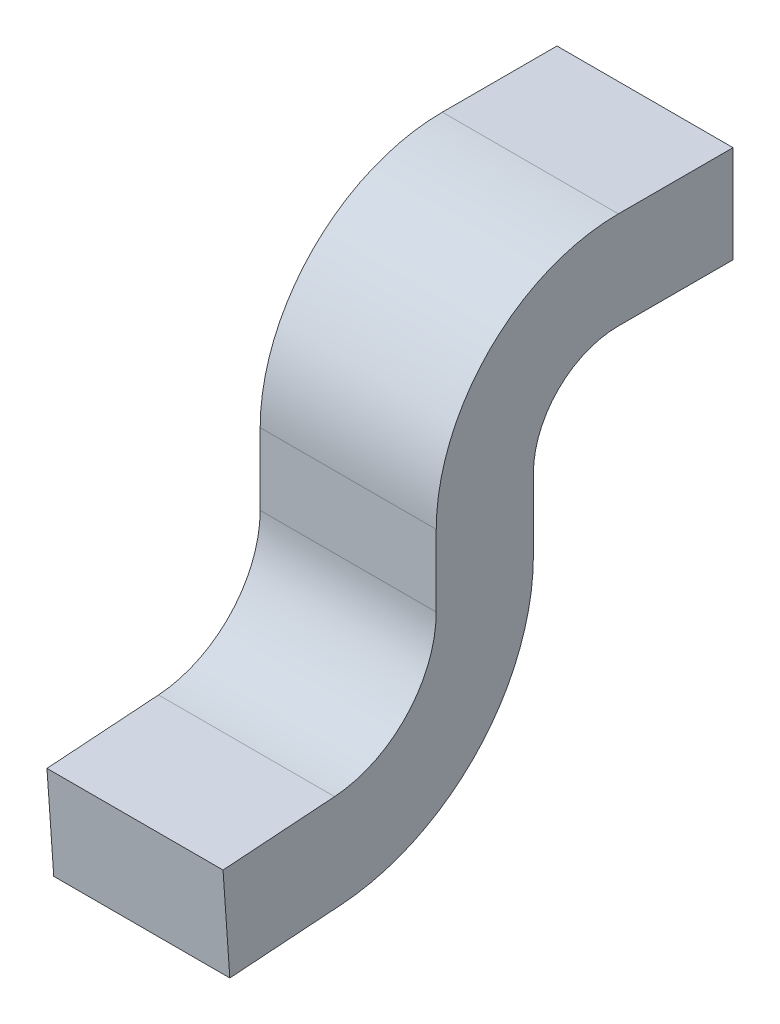
ISO-10303-21;
HEADER;
FILE_DESCRIPTION(('STEP AP214'),'2;1');
FILE_NAME('part.step','',(''),(''),'','','');
FILE_SCHEMA(('AUTOMOTIVE_DESIGN { 1 0 10303 214 1 1 1 1 }'));
ENDSEC;
DATA;
#1=APPLICATION_CONTEXT('core data for automotive mechanical design processes');
#2=APPLICATION_PROTOCOL_DEFINITION('international standard','automotive_design',2000,#1);
#3=PRODUCT_CONTEXT('',#1,'mechanical');
#4=PRODUCT('Part','Part','',(#3));
#5=PRODUCT_RELATED_PRODUCT_CATEGORY('part','',(#4));
#6=PRODUCT_DEFINITION_FORMATION('','',#4);
#7=PRODUCT_DEFINITION_CONTEXT('part definition',#1,'design');
#8=PRODUCT_DEFINITION('design','',#6,#7);
#9=PRODUCT_DEFINITION_SHAPE('','',#8);
#10=(LENGTH_UNIT() NAMED_UNIT(*) SI_UNIT(.MILLI.,.METRE.));
#11=(NAMED_UNIT(*) PLANE_ANGLE_UNIT() SI_UNIT($,.RADIAN.));
#12=(NAMED_UNIT(*) SI_UNIT($,.STERADIAN.) SOLID_ANGLE_UNIT());
#13=UNCERTAINTY_MEASURE_WITH_UNIT(LENGTH_MEASURE(1.E-05),#10,'distance_accuracy_value','');
#14=(GEOMETRIC_REPRESENTATION_CONTEXT(3) GLOBAL_UNCERTAINTY_ASSIGNED_CONTEXT((#13)) GLOBAL_UNIT_ASSIGNED_CONTEXT((#10,
#11,#12)) REPRESENTATION_CONTEXT('',''));
#15=CARTESIAN_POINT('',(0.,0.,0.));
#16=DIRECTION('',(0.,0.,1.));
#17=DIRECTION('',(1.,0.,0.));
#18=AXIS2_PLACEMENT_3D('',#15,#16,#17);
#19=CARTESIAN_POINT('',(-0.18415,0.,0.));
#20=DIRECTION('',(1.,0.,0.));
#21=DIRECTION('',(0.,0.,-1.));
#22=AXIS2_PLACEMENT_3D('',#19,#20,#21);
#23=PLANE('',#22);
#24=DIRECTION('',(0.,-0.997564050259825,-0.0697564737441177));
#25=VECTOR('',#24,1.);
#26=CARTESIAN_POINT('',(-0.18415,-0.152894984987,0.649174515465));
#27=LINE('',#26,#25);
#28=CARTESIAN_POINT('',(-0.18415,-0.152894984987171,0.649174515464988));
#29=VERTEX_POINT('',#28);
#30=CARTESIAN_POINT('',(-0.18415,-0.355600000000004,0.63500000000006));
#31=VERTEX_POINT('',#30);
#32=EDGE_CURVE('E186',#29,#31,#27,.T.);
#33=ORIENTED_EDGE('',*,*,#32,.F.);
#34=DIRECTION('',(0.,-0.0697564737441177,0.997564050259825));
#35=VECTOR('',#34,1.);
#36=CARTESIAN_POINT('',(-0.18415,-0.121709408913,0.2032));
#37=LINE('',#36,#35);
#38=CARTESIAN_POINT('',(-0.18415,-0.13657960211132,0.415853670102026));
#39=VERTEX_POINT('',#38);
#40=EDGE_CURVE('E192',#39,#29,#37,.T.);
#41=ORIENTED_EDGE('',*,*,#40,.F.);
#42=CARTESIAN_POINT('',(-0.18415,0.09146353977837,0.4318));
#43=DIRECTION('',(1.,0.,0.));
#44=DIRECTION('',(0.,0.,-1.));
#45=AXIS2_PLACEMENT_3D('',#42,#43,#44);
#46=CIRCLE('',#45,0.2286);
#47=CARTESIAN_POINT('',(-0.18415,0.09146353977837,0.2032));
#48=VERTEX_POINT('',#47);
#49=EDGE_CURVE('E200',#39,#48,#46,.T.);
#50=ORIENTED_EDGE('',*,*,#49,.T.);
#51=DIRECTION('',(0.,1.,0.));
#52=VECTOR('',#51,1.);
#53=CARTESIAN_POINT('',(-0.18415,0.,0.2032));
#54=LINE('',#53,#52);
#55=CARTESIAN_POINT('',(-0.18415,0.2413,0.2032));
#56=VERTEX_POINT('',#55);
#57=EDGE_CURVE('E136',#56,#48,#54,.F.);
#58=ORIENTED_EDGE('',*,*,#57,.F.);
#59=CARTESIAN_POINT('',(-0.18415,0.2413,-0.1778));
#60=DIRECTION('',(-1.,0.,0.));
#61=DIRECTION('',(0.,0.,1.));
#62=AXIS2_PLACEMENT_3D('',#59,#60,#61);
#63=CIRCLE('',#62,0.381);
#64=CARTESIAN_POINT('',(-0.18415,0.6223,-0.1778));
#65=VERTEX_POINT('',#64);
#66=EDGE_CURVE('E20',#65,#56,#63,.F.);
#67=ORIENTED_EDGE('',*,*,#66,.F.);
#68=DIRECTION('',(0.,0.,1.));
#69=VECTOR('',#68,1.);
#70=CARTESIAN_POINT('',(-0.18415,0.6223,-0.417625484535));
#71=LINE('',#70,#69);
#72=CARTESIAN_POINT('',(-0.18415,0.6223,-0.417625484535));
#73=VERTEX_POINT('',#72);
#74=EDGE_CURVE('E134',#73,#65,#71,.T.);
#75=ORIENTED_EDGE('',*,*,#74,.F.);
#76=DIRECTION('',(0.,1.,0.));
#77=VECTOR('',#76,1.);
#78=CARTESIAN_POINT('',(-0.18415,0.4191,-0.417625484535));
#79=LINE('',#78,#77);
#80=CARTESIAN_POINT('',(-0.18415,0.4191,-0.417625484535));
#81=VERTEX_POINT('',#80);
#82=EDGE_CURVE('E154',#81,#73,#79,.T.);
#83=ORIENTED_EDGE('',*,*,#82,.F.);
#84=DIRECTION('',(0.,0.,-1.));
#85=VECTOR('',#84,1.);
#86=CARTESIAN_POINT('',(-0.18415,0.4191,0.));
#87=LINE('',#86,#85);
#88=CARTESIAN_POINT('',(-0.18415,0.4191,-0.1778));
#89=VERTEX_POINT('',#88);
#90=EDGE_CURVE('E166',#89,#81,#87,.T.);
#91=ORIENTED_EDGE('',*,*,#90,.F.);
#92=CARTESIAN_POINT('',(-0.18415,0.2413,-0.1778));
#93=DIRECTION('',(1.,0.,0.));
#94=DIRECTION('',(0.,0.,-1.));
#95=AXIS2_PLACEMENT_3D('',#92,#93,#94);
#96=CIRCLE('',#95,0.1778);
#97=CARTESIAN_POINT('',(-0.18415,0.2413,0.));
#98=VERTEX_POINT('',#97);
#99=EDGE_CURVE('E176',#89,#98,#96,.T.);
#100=ORIENTED_EDGE('',*,*,#99,.T.);
#101=DIRECTION('',(0.,1.,0.));
#102=VECTOR('',#101,1.);
#103=CARTESIAN_POINT('',(-0.18415,-0.311196474416,0.));
#104=LINE('',#103,#102);
#105=CARTESIAN_POINT('',(-0.18415,0.09146353977837,0.));
#106=VERTEX_POINT('',#105);
#107=EDGE_CURVE('E172',#106,#98,#104,.T.);
#108=ORIENTED_EDGE('',*,*,#107,.F.);
#109=CARTESIAN_POINT('',(-0.18415,0.09146353977837,0.4318));
#110=DIRECTION('',(-1.,0.,0.));
#111=DIRECTION('',(0.,0.,1.));
#112=AXIS2_PLACEMENT_3D('',#109,#110,#111);
#113=CIRCLE('',#112,0.4318);
#114=CARTESIAN_POINT('',(-0.18415,-0.339284617123813,0.401679154637152));
#115=VERTEX_POINT('',#114);
#116=EDGE_CURVE('E182',#115,#106,#113,.F.);
#117=ORIENTED_EDGE('',*,*,#116,.F.);
#118=DIRECTION('',(0.,0.0697564737441177,-0.997564050259825));
#119=VECTOR('',#118,1.);
#120=CARTESIAN_POINT('',(-0.18415,-0.3556,0.635));
#121=LINE('',#120,#119);
#122=EDGE_CURVE('E178',#31,#115,#121,.T.);
#123=ORIENTED_EDGE('',*,*,#122,.F.);
#124=EDGE_LOOP('',(#33,#41,#50,#58,#67,#75,#83,#91,#100,#108,#117,#123));
#125=FACE_BOUND('',#124,.T.);
#126=ADVANCED_FACE('F17',(#125),#23,.F.);
#127=CARTESIAN_POINT('',(-0.18415,0.2413,-0.1778));
#128=DIRECTION('',(-1.,0.,0.));
#129=DIRECTION('',(0.,0.,1.));
#130=AXIS2_PLACEMENT_3D('',#127,#128,#129);
#131=CYLINDRICAL_SURFACE('',#130,0.381);
#132=CARTESIAN_POINT('',(0.18415,0.2413,-0.1778));
#133=DIRECTION('',(-1.,0.,0.));
#134=DIRECTION('',(0.,0.,1.));
#135=AXIS2_PLACEMENT_3D('',#132,#133,#134);
#136=CIRCLE('',#135,0.381);
#137=CARTESIAN_POINT('',(0.18415,0.6223,-0.1778));
#138=VERTEX_POINT('',#137);
#139=CARTESIAN_POINT('',(0.18415,0.2413,0.2032));
#140=VERTEX_POINT('',#139);
#141=EDGE_CURVE('E145',#138,#140,#136,.F.);
#142=ORIENTED_EDGE('',*,*,#141,.F.);
#143=DIRECTION('',(1.,0.,0.));
#144=VECTOR('',#143,1.);
#145=CARTESIAN_POINT('',(-0.18415,0.6223,-0.1778));
#146=LINE('',#145,#144);
#147=EDGE_CURVE('E142',#65,#138,#146,.T.);
#148=ORIENTED_EDGE('',*,*,#147,.F.);
#149=ORIENTED_EDGE('',*,*,#66,.T.);
#150=DIRECTION('',(1.,0.,0.));
#151=VECTOR('',#150,1.);
#152=CARTESIAN_POINT('',(-0.18415,0.2413,0.2032));
#153=LINE('',#152,#151);
#154=EDGE_CURVE('E140',#140,#56,#153,.F.);
#155=ORIENTED_EDGE('',*,*,#154,.F.);
#156=EDGE_LOOP('',(#142,#148,#149,#155));
#157=FACE_BOUND('',#156,.T.);
#158=ADVANCED_FACE('F143',(#157),#131,.T.);
#159=CARTESIAN_POINT('',(-0.18415,0.,0.2032));
#160=DIRECTION('',(0.,0.,1.));
#161=DIRECTION('',(1.,0.,0.));
#162=AXIS2_PLACEMENT_3D('',#159,#160,#161);
#163=PLANE('',#162);
#164=DIRECTION('',(1.,0.,0.));
#165=VECTOR('',#164,1.);
#166=CARTESIAN_POINT('',(-0.18415,0.09146353977837,0.2032));
#167=LINE('',#166,#165);
#168=CARTESIAN_POINT('',(0.18415,0.09146353977837,0.2032));
#169=VERTEX_POINT('',#168);
#170=EDGE_CURVE('E226',#48,#169,#167,.T.);
#171=ORIENTED_EDGE('',*,*,#170,.T.);
#172=DIRECTION('',(0.,1.,0.));
#173=VECTOR('',#172,1.);
#174=CARTESIAN_POINT('',(0.18415,0.,0.2032));
#175=LINE('',#174,#173);
#176=EDGE_CURVE('E217',#140,#169,#175,.F.);
#177=ORIENTED_EDGE('',*,*,#176,.F.);
#178=ORIENTED_EDGE('',*,*,#154,.T.);
#179=ORIENTED_EDGE('',*,*,#57,.T.);
#180=EDGE_LOOP('',(#171,#177,#178,#179));
#181=FACE_BOUND('',#180,.T.);
#182=ADVANCED_FACE('F408',(#181),#163,.T.);
#183=CARTESIAN_POINT('',(-0.18415,0.09146353977837,0.4318));
#184=DIRECTION('',(1.,0.,0.));
#185=DIRECTION('',(0.,0.,-1.));
#186=AXIS2_PLACEMENT_3D('',#183,#184,#185);
#187=CYLINDRICAL_SURFACE('',#186,0.2286);
#188=ORIENTED_EDGE('',*,*,#49,.F.);
#189=DIRECTION('',(1.,0.,0.));
#190=VECTOR('',#189,1.);
#191=CARTESIAN_POINT('',(-0.18415,-0.136579602111317,0.415853670101978));
#192=LINE('',#191,#190);
#193=CARTESIAN_POINT('',(0.18415,-0.136579602111168,0.415853670102133));
#194=VERTEX_POINT('',#193);
#195=EDGE_CURVE('E195',#194,#39,#192,.F.);
#196=ORIENTED_EDGE('',*,*,#195,.F.);
#197=CARTESIAN_POINT('',(0.18415,0.09146353977837,0.4318));
#198=DIRECTION('',(1.,0.,0.));
#199=DIRECTION('',(0.,0.,-1.));
#200=AXIS2_PLACEMENT_3D('',#197,#198,#199);
#201=CIRCLE('',#200,0.2286);
#202=EDGE_CURVE('E212',#169,#194,#201,.F.);
#203=ORIENTED_EDGE('',*,*,#202,.F.);
#204=ORIENTED_EDGE('',*,*,#170,.F.);
#205=EDGE_LOOP('',(#188,#196,#203,#204));
#206=FACE_BOUND('',#205,.T.);
#207=ADVANCED_FACE('F398',(#206),#187,.F.);
#208=CARTESIAN_POINT('',(-0.18415,-0.121709408913,0.2032));
#209=DIRECTION('',(0.,0.997564050259825,0.0697564737441177));
#210=DIRECTION('',(0.,-0.0697564737441177,0.997564050259825));
#211=AXIS2_PLACEMENT_3D('',#208,#209,#210);
#212=PLANE('',#211);
#213=DIRECTION('',(1.,0.,0.));
#214=VECTOR('',#213,1.);
#215=CARTESIAN_POINT('',(-0.18415,-0.152894984987,0.649174515465));
#216=LINE('',#215,#214);
#217=CARTESIAN_POINT('',(0.18415,-0.152894984987,0.649174515465));
#218=VERTEX_POINT('',#217);
#219=EDGE_CURVE('E189',#218,#29,#216,.F.);
#220=ORIENTED_EDGE('',*,*,#219,.F.);
#221=DIRECTION('',(0.,-0.0697564737432769,0.997564050259884));
#222=VECTOR('',#221,1.);
#223=CARTESIAN_POINT('',(0.18415,-0.136579602111,0.415853670102));
#224=LINE('',#223,#222);
#225=EDGE_CURVE('E216',#194,#218,#224,.T.);
#226=ORIENTED_EDGE('',*,*,#225,.F.);
#227=ORIENTED_EDGE('',*,*,#195,.T.);
#228=ORIENTED_EDGE('',*,*,#40,.T.);
#229=EDGE_LOOP('',(#220,#226,#227,#228));
#230=FACE_BOUND('',#229,.T.);
#231=ADVANCED_FACE('F388',(#230),#212,.T.);
#232=CARTESIAN_POINT('',(-0.18415,-0.152894984987,0.649174515465));
#233=DIRECTION('',(0.,-0.0697564737441177,0.997564050259825));
#234=DIRECTION('',(0.,-0.997564050259825,-0.0697564737441177));
#235=AXIS2_PLACEMENT_3D('',#232,#233,#234);
#236=PLANE('',#235);
#237=DIRECTION('',(1.,0.,0.));
#238=VECTOR('',#237,1.);
#239=CARTESIAN_POINT('',(-0.18415,-0.3556,0.635));
#240=LINE('',#239,#238);
#241=CARTESIAN_POINT('',(0.18415,-0.3556,0.635));
#242=VERTEX_POINT('',#241);
#243=EDGE_CURVE('E183',#242,#31,#240,.F.);
#244=ORIENTED_EDGE('',*,*,#243,.F.);
#245=DIRECTION('',(0.,-0.997564050259763,-0.0697564737450046));
#246=VECTOR('',#245,1.);
#247=CARTESIAN_POINT('',(0.18415,-0.152894984987,0.649174515465));
#248=LINE('',#247,#246);
#249=EDGE_CURVE('E245',#218,#242,#248,.T.);
#250=ORIENTED_EDGE('',*,*,#249,.F.);
#251=ORIENTED_EDGE('',*,*,#219,.T.);
#252=ORIENTED_EDGE('',*,*,#32,.T.);
#253=EDGE_LOOP('',(#244,#250,#251,#252));
#254=FACE_BOUND('',#253,.T.);
#255=ADVANCED_FACE('F378',(#254),#236,.T.);
#256=CARTESIAN_POINT('',(-0.18415,-0.3556,0.635));
#257=DIRECTION('',(0.,-0.997564050259825,-0.0697564737441177));
#258=DIRECTION('',(0.,0.0697564737441177,-0.997564050259825));
#259=AXIS2_PLACEMENT_3D('',#256,#257,#258);
#260=PLANE('',#259);
#261=DIRECTION('',(-1.,0.,0.));
#262=VECTOR('',#261,1.);
#263=CARTESIAN_POINT('',(-0.18415,-0.339284617123803,0.401679154637014));
#264=LINE('',#263,#262);
#265=CARTESIAN_POINT('',(0.18415,-0.339284617123924,0.401679154637327));
#266=VERTEX_POINT('',#265);
#267=EDGE_CURVE('E224',#266,#115,#264,.T.);
#268=ORIENTED_EDGE('',*,*,#267,.F.);
#269=DIRECTION('',(0.,0.0697564737432772,-0.997564050259884));
#270=VECTOR('',#269,1.);
#271=CARTESIAN_POINT('',(0.18415,-0.3556,0.635));
#272=LINE('',#271,#270);
#273=EDGE_CURVE('E211',#242,#266,#272,.T.);
#274=ORIENTED_EDGE('',*,*,#273,.F.);
#275=ORIENTED_EDGE('',*,*,#243,.T.);
#276=ORIENTED_EDGE('',*,*,#122,.T.);
#277=EDGE_LOOP('',(#268,#274,#275,#276));
#278=FACE_BOUND('',#277,.T.);
#279=ADVANCED_FACE('F368',(#278),#260,.T.);
#280=CARTESIAN_POINT('',(-0.18415,0.09146353977837,0.4318));
#281=DIRECTION('',(-1.,0.,0.));
#282=DIRECTION('',(0.,0.,1.));
#283=AXIS2_PLACEMENT_3D('',#280,#281,#282);
#284=CYLINDRICAL_SURFACE('',#283,0.4318);
#285=CARTESIAN_POINT('',(0.18415,0.09146353977837,0.4318));
#286=DIRECTION('',(-1.,0.,0.));
#287=DIRECTION('',(0.,0.,1.));
#288=AXIS2_PLACEMENT_3D('',#285,#286,#287);
#289=CIRCLE('',#288,0.4318);
#290=CARTESIAN_POINT('',(0.18415,0.09146353977837,0.));
#291=VERTEX_POINT('',#290);
#292=EDGE_CURVE('E207',#266,#291,#289,.F.);
#293=ORIENTED_EDGE('',*,*,#292,.F.);
#294=ORIENTED_EDGE('',*,*,#267,.T.);
#295=ORIENTED_EDGE('',*,*,#116,.T.);
#296=DIRECTION('',(-1.,0.,0.));
#297=VECTOR('',#296,1.);
#298=CARTESIAN_POINT('',(-0.18415,0.09146353977837,0.));
#299=LINE('',#298,#297);
#300=EDGE_CURVE('E177',#291,#106,#299,.T.);
#301=ORIENTED_EDGE('',*,*,#300,.F.);
#302=EDGE_LOOP('',(#293,#294,#295,#301));
#303=FACE_BOUND('',#302,.T.);
#304=ADVANCED_FACE('F358',(#303),#284,.T.);
#305=CARTESIAN_POINT('',(-0.18415,-0.311196474416,0.));
#306=DIRECTION('',(0.,0.,-1.));
#307=DIRECTION('',(-1.,0.,0.));
#308=AXIS2_PLACEMENT_3D('',#305,#306,#307);
#309=PLANE('',#308);
#310=ORIENTED_EDGE('',*,*,#300,.T.);
#311=ORIENTED_EDGE('',*,*,#107,.T.);
#312=DIRECTION('',(1.,0.,0.));
#313=VECTOR('',#312,1.);
#314=CARTESIAN_POINT('',(-0.18415,0.2413,0.));
#315=LINE('',#314,#313);
#316=CARTESIAN_POINT('',(0.18415,0.2413,0.));
#317=VERTEX_POINT('',#316);
#318=EDGE_CURVE('E222',#98,#317,#315,.T.);
#319=ORIENTED_EDGE('',*,*,#318,.T.);
#320=DIRECTION('',(0.,1.,0.));
#321=VECTOR('',#320,1.);
#322=CARTESIAN_POINT('',(0.18415,0.,0.));
#323=LINE('',#322,#321);
#324=EDGE_CURVE('E206',#291,#317,#323,.T.);
#325=ORIENTED_EDGE('',*,*,#324,.F.);
#326=EDGE_LOOP('',(#310,#311,#319,#325));
#327=FACE_BOUND('',#326,.T.);
#328=ADVANCED_FACE('F348',(#327),#309,.T.);
#329=CARTESIAN_POINT('',(-0.18415,0.2413,-0.1778));
#330=DIRECTION('',(1.,0.,0.));
#331=DIRECTION('',(0.,0.,-1.));
#332=AXIS2_PLACEMENT_3D('',#329,#330,#331);
#333=CYLINDRICAL_SURFACE('',#332,0.1778);
#334=ORIENTED_EDGE('',*,*,#99,.F.);
#335=DIRECTION('',(1.,0.,0.));
#336=VECTOR('',#335,1.);
#337=CARTESIAN_POINT('',(-0.18415,0.4191,-0.1778));
#338=LINE('',#337,#336);
#339=CARTESIAN_POINT('',(0.18415,0.4191,-0.1778));
#340=VERTEX_POINT('',#339);
#341=EDGE_CURVE('E169',#340,#89,#338,.F.);
#342=ORIENTED_EDGE('',*,*,#341,.F.);
#343=CARTESIAN_POINT('',(0.18415,0.2413,-0.1778));
#344=DIRECTION('',(1.,0.,0.));
#345=DIRECTION('',(0.,0.,-1.));
#346=AXIS2_PLACEMENT_3D('',#343,#344,#345);
#347=CIRCLE('',#346,0.1778);
#348=EDGE_CURVE('E201',#317,#340,#347,.F.);
#349=ORIENTED_EDGE('',*,*,#348,.F.);
#350=ORIENTED_EDGE('',*,*,#318,.F.);
#351=EDGE_LOOP('',(#334,#342,#349,#350));
#352=FACE_BOUND('',#351,.T.);
#353=ADVANCED_FACE('F314',(#352),#333,.F.);
#354=CARTESIAN_POINT('',(-0.18415,0.4191,0.));
#355=DIRECTION('',(0.,-1.,0.));
#356=DIRECTION('',(0.,0.,-1.));
#357=AXIS2_PLACEMENT_3D('',#354,#355,#356);
#358=PLANE('',#357);
#359=DIRECTION('',(-1.,0.,0.));
#360=VECTOR('',#359,1.);
#361=CARTESIAN_POINT('',(-0.18415,0.4191,-0.417625484535));
#362=LINE('',#361,#360);
#363=CARTESIAN_POINT('',(0.18415,0.4191,-0.417625484535));
#364=VERTEX_POINT('',#363);
#365=EDGE_CURVE('E163',#364,#81,#362,.T.);
#366=ORIENTED_EDGE('',*,*,#365,.F.);
#367=DIRECTION('',(0.,0.,-1.));
#368=VECTOR('',#367,1.);
#369=CARTESIAN_POINT('',(0.18415,0.4191,0.));
#370=LINE('',#369,#368);
#371=EDGE_CURVE('E205',#340,#364,#370,.T.);
#372=ORIENTED_EDGE('',*,*,#371,.F.);
#373=ORIENTED_EDGE('',*,*,#341,.T.);
#374=ORIENTED_EDGE('',*,*,#90,.T.);
#375=EDGE_LOOP('',(#366,#372,#373,#374));
#376=FACE_BOUND('',#375,.T.);
#377=ADVANCED_FACE('F303',(#376),#358,.T.);
#378=CARTESIAN_POINT('',(-0.18415,0.4191,-0.417625484535));
#379=DIRECTION('',(0.,0.,-1.));
#380=DIRECTION('',(-1.,0.,0.));
#381=AXIS2_PLACEMENT_3D('',#378,#379,#380);
#382=PLANE('',#381);
#383=DIRECTION('',(1.,0.,0.));
#384=VECTOR('',#383,1.);
#385=CARTESIAN_POINT('',(-0.18415,0.6223,-0.417625484535));
#386=LINE('',#385,#384);
#387=CARTESIAN_POINT('',(0.18415,0.6223,-0.417625484535));
#388=VERTEX_POINT('',#387);
#389=EDGE_CURVE('E40',#388,#73,#386,.F.);
#390=ORIENTED_EDGE('',*,*,#389,.F.);
#391=DIRECTION('',(0.,1.,0.));
#392=VECTOR('',#391,1.);
#393=CARTESIAN_POINT('',(0.18415,0.,-0.417625484535));
#394=LINE('',#393,#392);
#395=EDGE_CURVE('E27',#364,#388,#394,.T.);
#396=ORIENTED_EDGE('',*,*,#395,.F.);
#397=ORIENTED_EDGE('',*,*,#365,.T.);
#398=ORIENTED_EDGE('',*,*,#82,.T.);
#399=EDGE_LOOP('',(#390,#396,#397,#398));
#400=FACE_BOUND('',#399,.T.);
#401=ADVANCED_FACE('F305',(#400),#382,.T.);
#402=CARTESIAN_POINT('',(-0.18415,0.6223,-0.417625484535));
#403=DIRECTION('',(0.,1.,0.));
#404=DIRECTION('',(0.,0.,1.));
#405=AXIS2_PLACEMENT_3D('',#402,#403,#404);
#406=PLANE('',#405);
#407=ORIENTED_EDGE('',*,*,#147,.T.);
#408=DIRECTION('',(0.,0.,-1.));
#409=VECTOR('',#408,1.);
#410=CARTESIAN_POINT('',(0.18415,0.6223,0.));
#411=LINE('',#410,#409);
#412=EDGE_CURVE('E11',#388,#138,#411,.F.);
#413=ORIENTED_EDGE('',*,*,#412,.F.);
#414=ORIENTED_EDGE('',*,*,#389,.T.);
#415=ORIENTED_EDGE('',*,*,#74,.T.);
#416=EDGE_LOOP('',(#407,#413,#414,#415));
#417=FACE_BOUND('',#416,.T.);
#418=ADVANCED_FACE('F149',(#417),#406,.T.);
#419=CARTESIAN_POINT('',(0.18415,0.,0.));
#420=DIRECTION('',(1.,0.,0.));
#421=DIRECTION('',(0.,0.,-1.));
#422=AXIS2_PLACEMENT_3D('',#419,#420,#421);
#423=PLANE('',#422);
#424=ORIENTED_EDGE('',*,*,#395,.T.);
#425=ORIENTED_EDGE('',*,*,#412,.T.);
#426=ORIENTED_EDGE('',*,*,#141,.T.);
#427=ORIENTED_EDGE('',*,*,#176,.T.);
#428=ORIENTED_EDGE('',*,*,#202,.T.);
#429=ORIENTED_EDGE('',*,*,#225,.T.);
#430=ORIENTED_EDGE('',*,*,#249,.T.);
#431=ORIENTED_EDGE('',*,*,#273,.T.);
#432=ORIENTED_EDGE('',*,*,#292,.T.);
#433=ORIENTED_EDGE('',*,*,#324,.T.);
#434=ORIENTED_EDGE('',*,*,#348,.T.);
#435=ORIENTED_EDGE('',*,*,#371,.T.);
#436=EDGE_LOOP('',(#424,#425,#426,#427,#428,#429,#430,#431,#432,#433,#434,#435));
#437=FACE_BOUND('',#436,.T.);
#438=ADVANCED_FACE('F300',(#437),#423,.T.);
#439=CLOSED_SHELL('',(#126,#158,#182,#207,#231,#255,#279,#304,#328,#353,#377,#401,#418,#438));
#440=MANIFOLD_SOLID_BREP('B1',#439);
#441=ADVANCED_BREP_SHAPE_REPRESENTATION('',(#18,#440),#14);
#442=SHAPE_DEFINITION_REPRESENTATION(#9,#441);
ENDSEC;
END-ISO-10303-21;
